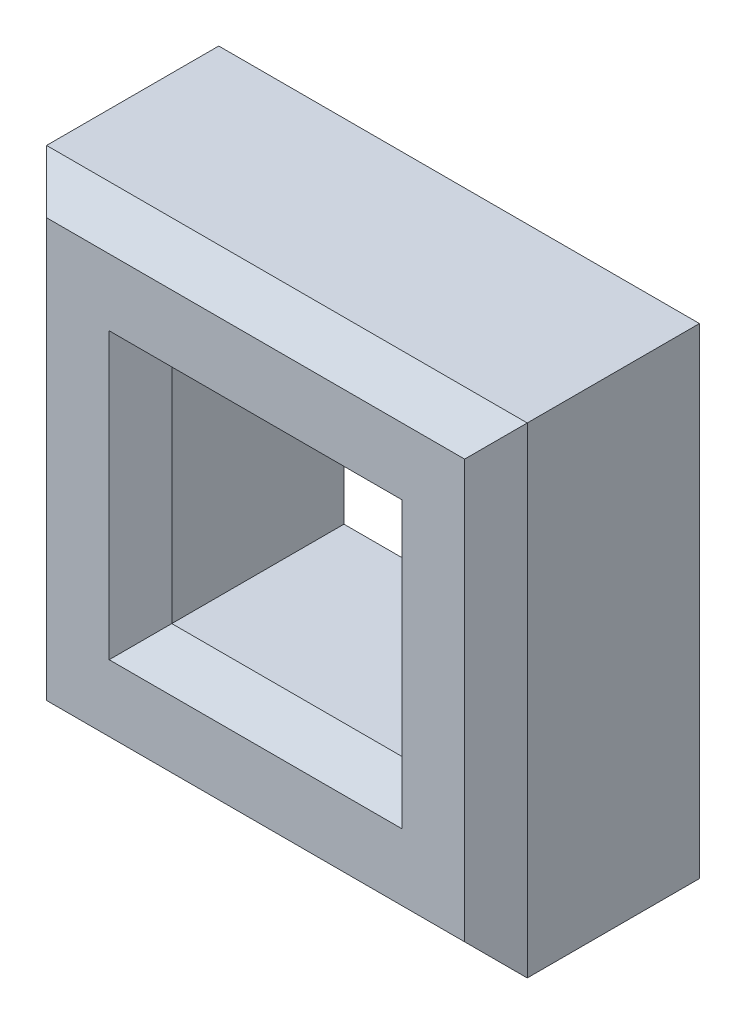
ISO-10303-21;
HEADER;
FILE_DESCRIPTION(('STEP AP214'),'2;1');
FILE_NAME('part.step','',(''),(''),'','','');
FILE_SCHEMA(('AUTOMOTIVE_DESIGN { 1 0 10303 214 1 1 1 1 }'));
ENDSEC;
DATA;
#1=APPLICATION_CONTEXT('core data for automotive mechanical design processes');
#2=APPLICATION_PROTOCOL_DEFINITION('international standard','automotive_design',2000,#1);
#3=PRODUCT_CONTEXT('',#1,'mechanical');
#4=PRODUCT('Part','Part','',(#3));
#5=PRODUCT_RELATED_PRODUCT_CATEGORY('part','',(#4));
#6=PRODUCT_DEFINITION_FORMATION('','',#4);
#7=PRODUCT_DEFINITION_CONTEXT('part definition',#1,'design');
#8=PRODUCT_DEFINITION('design','',#6,#7);
#9=PRODUCT_DEFINITION_SHAPE('','',#8);
#10=(LENGTH_UNIT() NAMED_UNIT(*) SI_UNIT(.MILLI.,.METRE.));
#11=(NAMED_UNIT(*) PLANE_ANGLE_UNIT() SI_UNIT($,.RADIAN.));
#12=(NAMED_UNIT(*) SI_UNIT($,.STERADIAN.) SOLID_ANGLE_UNIT());
#13=UNCERTAINTY_MEASURE_WITH_UNIT(LENGTH_MEASURE(1.E-05),#10,'distance_accuracy_value','');
#14=(GEOMETRIC_REPRESENTATION_CONTEXT(3) GLOBAL_UNCERTAINTY_ASSIGNED_CONTEXT((#13)) GLOBAL_UNIT_ASSIGNED_CONTEXT((#10,
#11,#12)) REPRESENTATION_CONTEXT('',''));
#15=CARTESIAN_POINT('',(0.,0.,0.));
#16=DIRECTION('',(0.,0.,1.));
#17=DIRECTION('',(1.,0.,0.));
#18=AXIS2_PLACEMENT_3D('',#15,#16,#17);
#19=CARTESIAN_POINT('',(0.,0.,6.5));
#20=DIRECTION('',(0.,0.,1.));
#21=DIRECTION('',(1.,0.,0.));
#22=AXIS2_PLACEMENT_3D('',#19,#20,#21);
#23=PLANE('',#22);
#24=DIRECTION('',(1.,0.,0.));
#25=VECTOR('',#24,1.);
#26=CARTESIAN_POINT('',(0.,4.55,6.5));
#27=LINE('',#26,#25);
#28=CARTESIAN_POINT('',(-4.67695526217005,4.55,6.5));
#29=VERTEX_POINT('',#28);
#30=CARTESIAN_POINT('',(4.67695526217005,4.55000000000001,6.5));
#31=VERTEX_POINT('',#30);
#32=EDGE_CURVE('E200',#29,#31,#27,.T.);
#33=ORIENTED_EDGE('',*,*,#32,.T.);
#34=DIRECTION('',(0.,-1.,0.));
#35=VECTOR('',#34,1.);
#36=CARTESIAN_POINT('',(4.67695526217005,0.,6.5));
#37=LINE('',#36,#35);
#38=CARTESIAN_POINT('',(4.67695526217005,-4.55,6.5));
#39=VERTEX_POINT('',#38);
#40=EDGE_CURVE('E202',#31,#39,#37,.T.);
#41=ORIENTED_EDGE('',*,*,#40,.T.);
#42=DIRECTION('',(-1.,0.,0.));
#43=VECTOR('',#42,1.);
#44=CARTESIAN_POINT('',(0.,-4.55,6.5));
#45=LINE('',#44,#43);
#46=CARTESIAN_POINT('',(-4.67695526217005,-4.55,6.5));
#47=VERTEX_POINT('',#46);
#48=EDGE_CURVE('E196',#39,#47,#45,.T.);
#49=ORIENTED_EDGE('',*,*,#48,.T.);
#50=DIRECTION('',(0.,1.,0.));
#51=VECTOR('',#50,1.);
#52=CARTESIAN_POINT('',(-4.67695526217005,0.,6.5));
#53=LINE('',#52,#51);
#54=EDGE_CURVE('E198',#47,#29,#53,.T.);
#55=ORIENTED_EDGE('',*,*,#54,.T.);
#56=EDGE_LOOP('',(#33,#41,#49,#55));
#57=FACE_BOUND('',#56,.T.);
#58=DIRECTION('',(0.,1.,0.));
#59=VECTOR('',#58,1.);
#60=CARTESIAN_POINT('',(6.67695526217004,7.67695526217005,6.5));
#61=LINE('',#60,#59);
#62=CARTESIAN_POINT('',(6.67695526217004,-6.67695526217004,6.5));
#63=VERTEX_POINT('',#62);
#64=CARTESIAN_POINT('',(6.67695526217004,6.67695526217004,6.5));
#65=VERTEX_POINT('',#64);
#66=EDGE_CURVE('E191',#63,#65,#61,.T.);
#67=ORIENTED_EDGE('',*,*,#66,.T.);
#68=DIRECTION('',(-1.,0.,0.));
#69=VECTOR('',#68,1.);
#70=CARTESIAN_POINT('',(-7.67695526217005,6.67695526217004,6.5));
#71=LINE('',#70,#69);
#72=CARTESIAN_POINT('',(-6.67695526217004,6.67695526217004,6.5));
#73=VERTEX_POINT('',#72);
#74=EDGE_CURVE('E193',#65,#73,#71,.T.);
#75=ORIENTED_EDGE('',*,*,#74,.T.);
#76=DIRECTION('',(0.,-1.,0.));
#77=VECTOR('',#76,1.);
#78=CARTESIAN_POINT('',(-6.67695526217004,-7.67695526217005,6.5));
#79=LINE('',#78,#77);
#80=CARTESIAN_POINT('',(-6.67695526217004,-6.67695526217004,6.5));
#81=VERTEX_POINT('',#80);
#82=EDGE_CURVE('E187',#73,#81,#79,.T.);
#83=ORIENTED_EDGE('',*,*,#82,.T.);
#84=DIRECTION('',(1.,0.,0.));
#85=VECTOR('',#84,1.);
#86=CARTESIAN_POINT('',(7.67695526217005,-6.67695526217004,6.5));
#87=LINE('',#86,#85);
#88=EDGE_CURVE('E189',#81,#63,#87,.T.);
#89=ORIENTED_EDGE('',*,*,#88,.T.);
#90=EDGE_LOOP('',(#67,#75,#83,#89));
#91=FACE_BOUND('',#90,.T.);
#92=ADVANCED_FACE('F35',(#57,#91),#23,.T.);
#93=CARTESIAN_POINT('',(0.,0.,0.));
#94=DIRECTION('',(0.,0.,1.));
#95=DIRECTION('',(1.,0.,0.));
#96=AXIS2_PLACEMENT_3D('',#93,#94,#95);
#97=PLANE('',#96);
#98=DIRECTION('',(0.,-1.,0.));
#99=VECTOR('',#98,1.);
#100=CARTESIAN_POINT('',(-7.67695526217005,-7.67695526217005,0.));
#101=LINE('',#100,#99);
#102=CARTESIAN_POINT('',(-7.67695526217005,7.67695526217005,0.));
#103=VERTEX_POINT('',#102);
#104=CARTESIAN_POINT('',(-7.67695526217005,-7.67695526217005,0.));
#105=VERTEX_POINT('',#104);
#106=EDGE_CURVE('E137',#103,#105,#101,.T.);
#107=ORIENTED_EDGE('',*,*,#106,.F.);
#108=DIRECTION('',(-1.,0.,0.));
#109=VECTOR('',#108,1.);
#110=CARTESIAN_POINT('',(7.67695526217005,7.67695526217005,0.));
#111=LINE('',#110,#109);
#112=CARTESIAN_POINT('',(7.67695526217005,7.67695526217005,0.));
#113=VERTEX_POINT('',#112);
#114=EDGE_CURVE('E173',#113,#103,#111,.T.);
#115=ORIENTED_EDGE('',*,*,#114,.F.);
#116=DIRECTION('',(0.,1.,0.));
#117=VECTOR('',#116,1.);
#118=CARTESIAN_POINT('',(7.67695526217005,-7.67695526217005,0.));
#119=LINE('',#118,#117);
#120=CARTESIAN_POINT('',(7.67695526217005,-7.67695526217005,0.));
#121=VERTEX_POINT('',#120);
#122=EDGE_CURVE('E170',#121,#113,#119,.T.);
#123=ORIENTED_EDGE('',*,*,#122,.F.);
#124=DIRECTION('',(1.,0.,0.));
#125=VECTOR('',#124,1.);
#126=CARTESIAN_POINT('',(7.67695526217005,-7.67695526217005,0.));
#127=LINE('',#126,#125);
#128=EDGE_CURVE('E167',#105,#121,#127,.T.);
#129=ORIENTED_EDGE('',*,*,#128,.F.);
#130=EDGE_LOOP('',(#107,#115,#123,#129));
#131=FACE_BOUND('',#130,.T.);
#132=DIRECTION('',(0.,-1.,0.));
#133=VECTOR('',#132,1.);
#134=CARTESIAN_POINT('',(-3.67695526217005,-3.55,0.));
#135=LINE('',#134,#133);
#136=CARTESIAN_POINT('',(-3.67695526217005,3.55,0.));
#137=VERTEX_POINT('',#136);
#138=CARTESIAN_POINT('',(-3.67695526217005,-3.55,0.));
#139=VERTEX_POINT('',#138);
#140=EDGE_CURVE('E131',#137,#139,#135,.T.);
#141=ORIENTED_EDGE('',*,*,#140,.T.);
#142=DIRECTION('',(1.,0.,0.));
#143=VECTOR('',#142,1.);
#144=CARTESIAN_POINT('',(3.67695526217005,-3.55,0.));
#145=LINE('',#144,#143);
#146=CARTESIAN_POINT('',(3.67695526217005,-3.55,0.));
#147=VERTEX_POINT('',#146);
#148=EDGE_CURVE('E141',#139,#147,#145,.T.);
#149=ORIENTED_EDGE('',*,*,#148,.T.);
#150=DIRECTION('',(0.,1.,0.));
#151=VECTOR('',#150,1.);
#152=CARTESIAN_POINT('',(3.67695526217005,-3.55,0.));
#153=LINE('',#152,#151);
#154=CARTESIAN_POINT('',(3.67695526217005,3.55,0.));
#155=VERTEX_POINT('',#154);
#156=EDGE_CURVE('E147',#147,#155,#153,.T.);
#157=ORIENTED_EDGE('',*,*,#156,.T.);
#158=DIRECTION('',(-1.,0.,0.));
#159=VECTOR('',#158,1.);
#160=CARTESIAN_POINT('',(3.67695526217005,3.55,0.));
#161=LINE('',#160,#159);
#162=EDGE_CURVE('E151',#155,#137,#161,.T.);
#163=ORIENTED_EDGE('',*,*,#162,.T.);
#164=EDGE_LOOP('',(#141,#149,#157,#163));
#165=FACE_BOUND('',#164,.T.);
#166=ADVANCED_FACE('F149',(#131,#165),#97,.F.);
#167=CARTESIAN_POINT('',(-7.67695526217005,-7.67695526217005,6.5));
#168=DIRECTION('',(1.,0.,0.));
#169=DIRECTION('',(0.,0.,-1.));
#170=AXIS2_PLACEMENT_3D('',#167,#168,#169);
#171=PLANE('',#170);
#172=DIRECTION('',(0.,0.,-1.));
#173=VECTOR('',#172,1.);
#174=CARTESIAN_POINT('',(-7.67695526217005,-7.67695526217005,6.5));
#175=LINE('',#174,#173);
#176=CARTESIAN_POINT('',(-7.67695526217005,-7.67695526217005,5.49999999999999));
#177=VERTEX_POINT('',#176);
#178=EDGE_CURVE('E182',#177,#105,#175,.T.);
#179=ORIENTED_EDGE('',*,*,#178,.F.);
#180=DIRECTION('',(0.,1.,0.));
#181=VECTOR('',#180,1.);
#182=CARTESIAN_POINT('',(-7.67695526217005,7.67695526217005,5.49999999999999));
#183=LINE('',#182,#181);
#184=CARTESIAN_POINT('',(-7.67695526217005,7.67695526217005,5.49999999999999));
#185=VERTEX_POINT('',#184);
#186=EDGE_CURVE('E11',#177,#185,#183,.T.);
#187=ORIENTED_EDGE('',*,*,#186,.T.);
#188=DIRECTION('',(0.,0.,-1.));
#189=VECTOR('',#188,1.);
#190=CARTESIAN_POINT('',(-7.67695526217005,7.67695526217005,6.5));
#191=LINE('',#190,#189);
#192=EDGE_CURVE('E176',#185,#103,#191,.T.);
#193=ORIENTED_EDGE('',*,*,#192,.T.);
#194=ORIENTED_EDGE('',*,*,#106,.T.);
#195=EDGE_LOOP('',(#179,#187,#193,#194));
#196=FACE_BOUND('',#195,.T.);
#197=ADVANCED_FACE('F242',(#196),#171,.F.);
#198=CARTESIAN_POINT('',(7.67695526217005,-7.67695526217005,6.5));
#199=DIRECTION('',(0.,1.,0.));
#200=DIRECTION('',(0.,0.,1.));
#201=AXIS2_PLACEMENT_3D('',#198,#199,#200);
#202=PLANE('',#201);
#203=DIRECTION('',(0.,0.,-1.));
#204=VECTOR('',#203,1.);
#205=CARTESIAN_POINT('',(7.67695526217005,-7.67695526217005,6.5));
#206=LINE('',#205,#204);
#207=CARTESIAN_POINT('',(7.67695526217005,-7.67695526217005,5.49999999999999));
#208=VERTEX_POINT('',#207);
#209=EDGE_CURVE('E180',#208,#121,#206,.T.);
#210=ORIENTED_EDGE('',*,*,#209,.F.);
#211=DIRECTION('',(-1.,0.,0.));
#212=VECTOR('',#211,1.);
#213=CARTESIAN_POINT('',(-7.67695526217005,-7.67695526217005,5.49999999999999));
#214=LINE('',#213,#212);
#215=EDGE_CURVE('E45',#208,#177,#214,.T.);
#216=ORIENTED_EDGE('',*,*,#215,.T.);
#217=ORIENTED_EDGE('',*,*,#178,.T.);
#218=ORIENTED_EDGE('',*,*,#128,.T.);
#219=EDGE_LOOP('',(#210,#216,#217,#218));
#220=FACE_BOUND('',#219,.T.);
#221=ADVANCED_FACE('F268',(#220),#202,.F.);
#222=CARTESIAN_POINT('',(7.67695526217005,-7.67695526217005,6.5));
#223=DIRECTION('',(-1.,0.,0.));
#224=DIRECTION('',(0.,0.,1.));
#225=AXIS2_PLACEMENT_3D('',#222,#223,#224);
#226=PLANE('',#225);
#227=DIRECTION('',(0.,0.,-1.));
#228=VECTOR('',#227,1.);
#229=CARTESIAN_POINT('',(7.67695526217005,7.67695526217005,6.5));
#230=LINE('',#229,#228);
#231=CARTESIAN_POINT('',(7.67695526217005,7.67695526217005,5.49999999999999));
#232=VERTEX_POINT('',#231);
#233=EDGE_CURVE('E178',#232,#113,#230,.T.);
#234=ORIENTED_EDGE('',*,*,#233,.F.);
#235=DIRECTION('',(0.,-1.,0.));
#236=VECTOR('',#235,1.);
#237=CARTESIAN_POINT('',(7.67695526217005,-7.67695526217005,5.49999999999999));
#238=LINE('',#237,#236);
#239=EDGE_CURVE('E60',#232,#208,#238,.T.);
#240=ORIENTED_EDGE('',*,*,#239,.T.);
#241=ORIENTED_EDGE('',*,*,#209,.T.);
#242=ORIENTED_EDGE('',*,*,#122,.T.);
#243=EDGE_LOOP('',(#234,#240,#241,#242));
#244=FACE_BOUND('',#243,.T.);
#245=ADVANCED_FACE('F265',(#244),#226,.F.);
#246=CARTESIAN_POINT('',(7.67695526217005,7.67695526217005,6.5));
#247=DIRECTION('',(0.,-1.,0.));
#248=DIRECTION('',(0.,0.,-1.));
#249=AXIS2_PLACEMENT_3D('',#246,#247,#248);
#250=PLANE('',#249);
#251=ORIENTED_EDGE('',*,*,#192,.F.);
#252=DIRECTION('',(1.,0.,0.));
#253=VECTOR('',#252,1.);
#254=CARTESIAN_POINT('',(7.67695526217005,7.67695526217005,5.49999999999999));
#255=LINE('',#254,#253);
#256=EDGE_CURVE('E210',#185,#232,#255,.T.);
#257=ORIENTED_EDGE('',*,*,#256,.T.);
#258=ORIENTED_EDGE('',*,*,#233,.T.);
#259=ORIENTED_EDGE('',*,*,#114,.T.);
#260=EDGE_LOOP('',(#251,#257,#258,#259));
#261=FACE_BOUND('',#260,.T.);
#262=ADVANCED_FACE('F245',(#261),#250,.F.);
#263=CARTESIAN_POINT('',(-3.67695526217005,-3.55,6.5));
#264=DIRECTION('',(1.,0.,0.));
#265=DIRECTION('',(0.,1.,0.));
#266=AXIS2_PLACEMENT_3D('',#263,#264,#265);
#267=PLANE('',#266);
#268=DIRECTION('',(0.,0.,-1.));
#269=VECTOR('',#268,1.);
#270=CARTESIAN_POINT('',(-3.67695526217005,3.55,6.5));
#271=LINE('',#270,#269);
#272=CARTESIAN_POINT('',(-3.67695526217005,3.55,5.5));
#273=VERTEX_POINT('',#272);
#274=EDGE_CURVE('E160',#273,#137,#271,.T.);
#275=ORIENTED_EDGE('',*,*,#274,.F.);
#276=DIRECTION('',(0.,-1.,0.));
#277=VECTOR('',#276,1.);
#278=CARTESIAN_POINT('',(-3.67695526217005,-3.55,5.5));
#279=LINE('',#278,#277);
#280=CARTESIAN_POINT('',(-3.67695526217005,-3.55,5.5));
#281=VERTEX_POINT('',#280);
#282=EDGE_CURVE('E134',#273,#281,#279,.T.);
#283=ORIENTED_EDGE('',*,*,#282,.T.);
#284=DIRECTION('',(0.,0.,-1.));
#285=VECTOR('',#284,1.);
#286=CARTESIAN_POINT('',(-3.67695526217005,-3.55,6.5));
#287=LINE('',#286,#285);
#288=EDGE_CURVE('E126',#281,#139,#287,.T.);
#289=ORIENTED_EDGE('',*,*,#288,.T.);
#290=ORIENTED_EDGE('',*,*,#140,.F.);
#291=EDGE_LOOP('',(#275,#283,#289,#290));
#292=FACE_BOUND('',#291,.T.);
#293=ADVANCED_FACE('F129',(#292),#267,.T.);
#294=CARTESIAN_POINT('',(3.67695526217005,-3.55,6.5));
#295=DIRECTION('',(0.,1.,0.));
#296=DIRECTION('',(-1.,0.,0.));
#297=AXIS2_PLACEMENT_3D('',#294,#295,#296);
#298=PLANE('',#297);
#299=ORIENTED_EDGE('',*,*,#288,.F.);
#300=DIRECTION('',(1.,0.,0.));
#301=VECTOR('',#300,1.);
#302=CARTESIAN_POINT('',(3.67695526217005,-3.55,5.5));
#303=LINE('',#302,#301);
#304=CARTESIAN_POINT('',(3.67695526217005,-3.55,5.5));
#305=VERTEX_POINT('',#304);
#306=EDGE_CURVE('E208',#281,#305,#303,.T.);
#307=ORIENTED_EDGE('',*,*,#306,.T.);
#308=DIRECTION('',(0.,0.,-1.));
#309=VECTOR('',#308,1.);
#310=CARTESIAN_POINT('',(3.67695526217005,-3.55,6.5));
#311=LINE('',#310,#309);
#312=EDGE_CURVE('E138',#305,#147,#311,.T.);
#313=ORIENTED_EDGE('',*,*,#312,.T.);
#314=ORIENTED_EDGE('',*,*,#148,.F.);
#315=EDGE_LOOP('',(#299,#307,#313,#314));
#316=FACE_BOUND('',#315,.T.);
#317=ADVANCED_FACE('F142',(#316),#298,.T.);
#318=CARTESIAN_POINT('',(3.67695526217005,-3.55,6.5));
#319=DIRECTION('',(-1.,0.,0.));
#320=DIRECTION('',(0.,-1.,0.));
#321=AXIS2_PLACEMENT_3D('',#318,#319,#320);
#322=PLANE('',#321);
#323=ORIENTED_EDGE('',*,*,#312,.F.);
#324=DIRECTION('',(0.,1.,0.));
#325=VECTOR('',#324,1.);
#326=CARTESIAN_POINT('',(3.67695526217005,-3.55,5.5));
#327=LINE('',#326,#325);
#328=CARTESIAN_POINT('',(3.67695526217005,3.55,5.5));
#329=VERTEX_POINT('',#328);
#330=EDGE_CURVE('E184',#305,#329,#327,.T.);
#331=ORIENTED_EDGE('',*,*,#330,.T.);
#332=DIRECTION('',(0.,0.,-1.));
#333=VECTOR('',#332,1.);
#334=CARTESIAN_POINT('',(3.67695526217005,3.55,6.5));
#335=LINE('',#334,#333);
#336=EDGE_CURVE('E162',#329,#155,#335,.T.);
#337=ORIENTED_EDGE('',*,*,#336,.T.);
#338=ORIENTED_EDGE('',*,*,#156,.F.);
#339=EDGE_LOOP('',(#323,#331,#337,#338));
#340=FACE_BOUND('',#339,.T.);
#341=ADVANCED_FACE('F342',(#340),#322,.T.);
#342=CARTESIAN_POINT('',(3.67695526217005,3.55,6.5));
#343=DIRECTION('',(0.,-1.,0.));
#344=DIRECTION('',(1.,0.,0.));
#345=AXIS2_PLACEMENT_3D('',#342,#343,#344);
#346=PLANE('',#345);
#347=ORIENTED_EDGE('',*,*,#336,.F.);
#348=DIRECTION('',(-1.,0.,0.));
#349=VECTOR('',#348,1.);
#350=CARTESIAN_POINT('',(3.67695526217005,3.55,5.5));
#351=LINE('',#350,#349);
#352=EDGE_CURVE('E205',#329,#273,#351,.T.);
#353=ORIENTED_EDGE('',*,*,#352,.T.);
#354=ORIENTED_EDGE('',*,*,#274,.T.);
#355=ORIENTED_EDGE('',*,*,#162,.F.);
#356=EDGE_LOOP('',(#347,#353,#354,#355));
#357=FACE_BOUND('',#356,.T.);
#358=ADVANCED_FACE('F300',(#357),#346,.T.);
#359=CARTESIAN_POINT('',(-3.67695526217005,-3.55,5.5));
#360=DIRECTION('',(-0.707106781186546,0.,-0.707106781186549));
#361=DIRECTION('',(0.,-1.,0.));
#362=AXIS2_PLACEMENT_3D('',#359,#360,#361);
#363=PLANE('',#362);
#364=DIRECTION('',(-0.577350269189627,0.577350269189626,0.577350269189624));
#365=VECTOR('',#364,1.);
#366=CARTESIAN_POINT('',(-1.22565175405668,1.09869649188663,3.04869649188664));
#367=LINE('',#366,#365);
#368=EDGE_CURVE('E155',#29,#273,#367,.F.);
#369=ORIENTED_EDGE('',*,*,#368,.F.);
#370=ORIENTED_EDGE('',*,*,#54,.F.);
#371=DIRECTION('',(-0.577350269189627,-0.577350269189626,0.577350269189624));
#372=VECTOR('',#371,1.);
#373=CARTESIAN_POINT('',(-3.67695526217005,-3.55,5.5));
#374=LINE('',#373,#372);
#375=EDGE_CURVE('E152',#281,#47,#374,.T.);
#376=ORIENTED_EDGE('',*,*,#375,.F.);
#377=ORIENTED_EDGE('',*,*,#282,.F.);
#378=EDGE_LOOP('',(#369,#370,#376,#377));
#379=FACE_BOUND('',#378,.T.);
#380=ADVANCED_FACE('F294',(#379),#363,.F.);
#381=CARTESIAN_POINT('',(3.67695526217005,-3.55,5.5));
#382=DIRECTION('',(0.,-0.707106781186546,-0.707106781186549));
#383=DIRECTION('',(1.,0.,0.));
#384=AXIS2_PLACEMENT_3D('',#381,#382,#383);
#385=PLANE('',#384);
#386=ORIENTED_EDGE('',*,*,#375,.T.);
#387=ORIENTED_EDGE('',*,*,#48,.F.);
#388=DIRECTION('',(-0.577350269189627,0.577350269189626,-0.577350269189625));
#389=VECTOR('',#388,1.);
#390=CARTESIAN_POINT('',(3.67695526217005,-3.55,5.5));
#391=LINE('',#390,#389);
#392=EDGE_CURVE('E217',#305,#39,#391,.F.);
#393=ORIENTED_EDGE('',*,*,#392,.F.);
#394=ORIENTED_EDGE('',*,*,#306,.F.);
#395=EDGE_LOOP('',(#386,#387,#393,#394));
#396=FACE_BOUND('',#395,.T.);
#397=ADVANCED_FACE('F287',(#396),#385,.F.);
#398=CARTESIAN_POINT('',(3.67695526217005,3.55,5.5));
#399=DIRECTION('',(0.,0.707106781186546,-0.707106781186549));
#400=DIRECTION('',(-1.,0.,0.));
#401=AXIS2_PLACEMENT_3D('',#398,#399,#400);
#402=PLANE('',#401);
#403=ORIENTED_EDGE('',*,*,#368,.T.);
#404=ORIENTED_EDGE('',*,*,#352,.F.);
#405=DIRECTION('',(0.577350269189626,0.577350269189627,0.577350269189625));
#406=VECTOR('',#405,1.);
#407=CARTESIAN_POINT('',(1.31028859550337,1.18333333333333,3.13333333333333));
#408=LINE('',#407,#406);
#409=EDGE_CURVE('E215',#31,#329,#408,.F.);
#410=ORIENTED_EDGE('',*,*,#409,.F.);
#411=ORIENTED_EDGE('',*,*,#32,.F.);
#412=EDGE_LOOP('',(#403,#404,#410,#411));
#413=FACE_BOUND('',#412,.T.);
#414=ADVANCED_FACE('F280',(#413),#402,.F.);
#415=CARTESIAN_POINT('',(3.67695526217005,-3.55,5.5));
#416=DIRECTION('',(0.707106781186546,0.,-0.707106781186549));
#417=DIRECTION('',(0.,1.,0.));
#418=AXIS2_PLACEMENT_3D('',#415,#416,#417);
#419=PLANE('',#418);
#420=ORIENTED_EDGE('',*,*,#392,.T.);
#421=ORIENTED_EDGE('',*,*,#40,.F.);
#422=ORIENTED_EDGE('',*,*,#409,.T.);
#423=ORIENTED_EDGE('',*,*,#330,.F.);
#424=EDGE_LOOP('',(#420,#421,#422,#423));
#425=FACE_BOUND('',#424,.T.);
#426=ADVANCED_FACE('F274',(#425),#419,.F.);
#427=CARTESIAN_POINT('',(0.,-6.67695526217004,6.5));
#428=DIRECTION('',(0.,-0.70710678118655,0.707106781186545));
#429=DIRECTION('',(-1.,0.,0.));
#430=AXIS2_PLACEMENT_3D('',#427,#428,#429);
#431=PLANE('',#430);
#432=DIRECTION('',(0.577350269189625,0.577350269189624,0.577350269189629));
#433=VECTOR('',#432,1.);
#434=CARTESIAN_POINT('',(-4.45130350811337,-4.45130350811337,8.72565175405669));
#435=LINE('',#434,#433);
#436=EDGE_CURVE('E224',#177,#81,#435,.T.);
#437=ORIENTED_EDGE('',*,*,#436,.F.);
#438=ORIENTED_EDGE('',*,*,#215,.F.);
#439=DIRECTION('',(-0.577350269189625,0.577350269189624,0.577350269189629));
#440=VECTOR('',#439,1.);
#441=CARTESIAN_POINT('',(4.45130350811337,-4.45130350811337,8.72565175405669));
#442=LINE('',#441,#440);
#443=EDGE_CURVE('E40',#63,#208,#442,.F.);
#444=ORIENTED_EDGE('',*,*,#443,.F.);
#445=ORIENTED_EDGE('',*,*,#88,.F.);
#446=EDGE_LOOP('',(#437,#438,#444,#445));
#447=FACE_BOUND('',#446,.T.);
#448=ADVANCED_FACE('F38',(#447),#431,.T.);
#449=CARTESIAN_POINT('',(6.67695526217004,0.,6.5));
#450=DIRECTION('',(0.70710678118655,0.,0.707106781186545));
#451=DIRECTION('',(0.,-1.,0.));
#452=AXIS2_PLACEMENT_3D('',#449,#450,#451);
#453=PLANE('',#452);
#454=ORIENTED_EDGE('',*,*,#443,.T.);
#455=ORIENTED_EDGE('',*,*,#239,.F.);
#456=DIRECTION('',(-0.577350269189625,-0.577350269189624,0.577350269189629));
#457=VECTOR('',#456,1.);
#458=CARTESIAN_POINT('',(4.45130350811337,4.45130350811338,8.72565175405669));
#459=LINE('',#458,#457);
#460=EDGE_CURVE('E223',#65,#232,#459,.F.);
#461=ORIENTED_EDGE('',*,*,#460,.F.);
#462=ORIENTED_EDGE('',*,*,#66,.F.);
#463=EDGE_LOOP('',(#454,#455,#461,#462));
#464=FACE_BOUND('',#463,.T.);
#465=ADVANCED_FACE('F234',(#464),#453,.T.);
#466=CARTESIAN_POINT('',(-6.67695526217004,0.,6.5));
#467=DIRECTION('',(-0.70710678118655,0.,0.707106781186545));
#468=DIRECTION('',(0.,1.,0.));
#469=AXIS2_PLACEMENT_3D('',#466,#467,#468);
#470=PLANE('',#469);
#471=ORIENTED_EDGE('',*,*,#436,.T.);
#472=ORIENTED_EDGE('',*,*,#82,.F.);
#473=DIRECTION('',(-0.577350269189625,0.577350269189624,-0.577350269189629));
#474=VECTOR('',#473,1.);
#475=CARTESIAN_POINT('',(-4.45130350811337,4.45130350811338,8.72565175405669));
#476=LINE('',#475,#474);
#477=EDGE_CURVE('E221',#185,#73,#476,.F.);
#478=ORIENTED_EDGE('',*,*,#477,.F.);
#479=ORIENTED_EDGE('',*,*,#186,.F.);
#480=EDGE_LOOP('',(#471,#472,#478,#479));
#481=FACE_BOUND('',#480,.T.);
#482=ADVANCED_FACE('F239',(#481),#470,.T.);
#483=CARTESIAN_POINT('',(0.,6.67695526217004,6.5));
#484=DIRECTION('',(0.,0.70710678118655,0.707106781186545));
#485=DIRECTION('',(1.,0.,0.));
#486=AXIS2_PLACEMENT_3D('',#483,#484,#485);
#487=PLANE('',#486);
#488=ORIENTED_EDGE('',*,*,#460,.T.);
#489=ORIENTED_EDGE('',*,*,#256,.F.);
#490=ORIENTED_EDGE('',*,*,#477,.T.);
#491=ORIENTED_EDGE('',*,*,#74,.F.);
#492=EDGE_LOOP('',(#488,#489,#490,#491));
#493=FACE_BOUND('',#492,.T.);
#494=ADVANCED_FACE('F249',(#493),#487,.T.);
#495=CLOSED_SHELL('',(#92,#166,#197,#221,#245,#262,#293,#317,#341,#358,#380,#397,#414,#426,#448,
#465,#482,#494));
#496=MANIFOLD_SOLID_BREP('B2',#495);
#497=ADVANCED_BREP_SHAPE_REPRESENTATION('',(#18,#496),#14);
#498=SHAPE_DEFINITION_REPRESENTATION(#9,#497);
ENDSEC;
END-ISO-10303-21;
